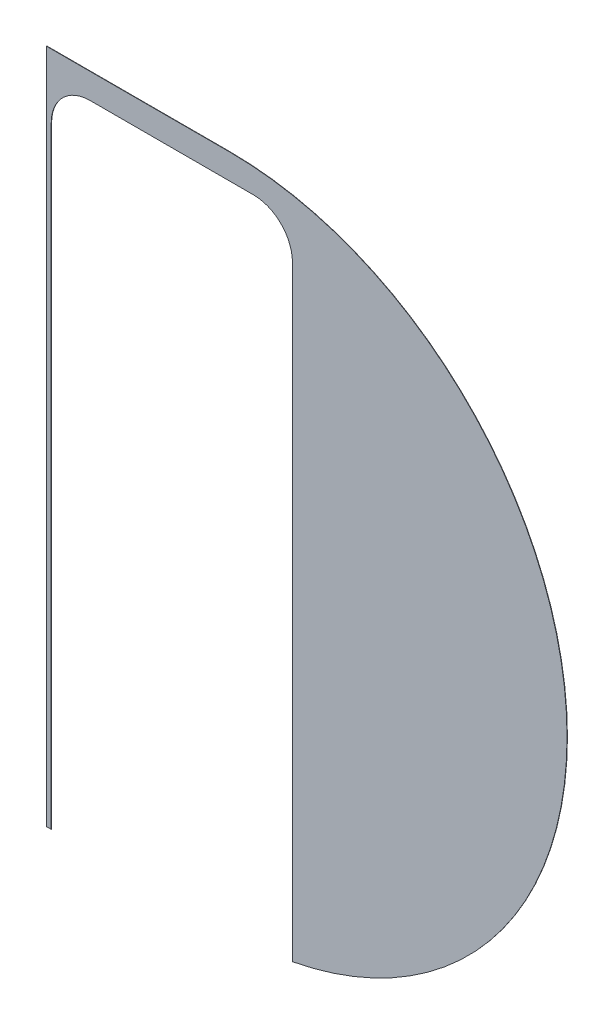
ISO-10303-21;
HEADER;
FILE_DESCRIPTION(('STEP AP214'),'2;1');
FILE_NAME('part.step','',(''),(''),'','','');
FILE_SCHEMA(('AUTOMOTIVE_DESIGN { 1 0 10303 214 1 1 1 1 }'));
ENDSEC;
DATA;
#1=APPLICATION_CONTEXT('core data for automotive mechanical design processes');
#2=APPLICATION_PROTOCOL_DEFINITION('international standard','automotive_design',2000,#1);
#3=PRODUCT_CONTEXT('',#1,'mechanical');
#4=PRODUCT('Part','Part','',(#3));
#5=PRODUCT_RELATED_PRODUCT_CATEGORY('part','',(#4));
#6=PRODUCT_DEFINITION_FORMATION('','',#4);
#7=PRODUCT_DEFINITION_CONTEXT('part definition',#1,'design');
#8=PRODUCT_DEFINITION('design','',#6,#7);
#9=PRODUCT_DEFINITION_SHAPE('','',#8);
#10=(LENGTH_UNIT() NAMED_UNIT(*) SI_UNIT(.MILLI.,.METRE.));
#11=(NAMED_UNIT(*) PLANE_ANGLE_UNIT() SI_UNIT($,.RADIAN.));
#12=(NAMED_UNIT(*) SI_UNIT($,.STERADIAN.) SOLID_ANGLE_UNIT());
#13=UNCERTAINTY_MEASURE_WITH_UNIT(LENGTH_MEASURE(1.E-05),#10,'distance_accuracy_value','');
#14=(GEOMETRIC_REPRESENTATION_CONTEXT(3) GLOBAL_UNCERTAINTY_ASSIGNED_CONTEXT((#13)) GLOBAL_UNIT_ASSIGNED_CONTEXT((#10,
#11,#12)) REPRESENTATION_CONTEXT('',''));
#15=CARTESIAN_POINT('',(0.,0.,0.));
#16=DIRECTION('',(0.,0.,1.));
#17=DIRECTION('',(1.,0.,0.));
#18=AXIS2_PLACEMENT_3D('',#15,#16,#17);
#19=CARTESIAN_POINT('',(0.,0.,1.));
#20=DIRECTION('',(1.,0.,0.));
#21=DIRECTION('',(0.,1.,0.));
#22=AXIS2_PLACEMENT_3D('',#19,#20,#21);
#23=PLANE('',#22);
#24=DIRECTION('',(0.,-1.,0.));
#25=VECTOR('',#24,1.);
#26=CARTESIAN_POINT('',(0.,0.,0.));
#27=LINE('',#26,#25);
#28=CARTESIAN_POINT('',(-3.33066907387547E-13,1740.,0.));
#29=VERTEX_POINT('',#28);
#30=CARTESIAN_POINT('',(0.,0.,0.));
#31=VERTEX_POINT('',#30);
#32=EDGE_CURVE('E142',#29,#31,#27,.T.);
#33=ORIENTED_EDGE('',*,*,#32,.T.);
#34=DIRECTION('',(0.,0.,-1.));
#35=VECTOR('',#34,1.);
#36=CARTESIAN_POINT('',(0.,0.,1.));
#37=LINE('',#36,#35);
#38=CARTESIAN_POINT('',(0.,0.,1.));
#39=VERTEX_POINT('',#38);
#40=EDGE_CURVE('E161',#39,#31,#37,.T.);
#41=ORIENTED_EDGE('',*,*,#40,.F.);
#42=DIRECTION('',(0.,-1.,0.));
#43=VECTOR('',#42,1.);
#44=CARTESIAN_POINT('',(0.,0.,1.));
#45=LINE('',#44,#43);
#46=CARTESIAN_POINT('',(-3.33066907387547E-13,1740.,1.));
#47=VERTEX_POINT('',#46);
#48=EDGE_CURVE('E143',#47,#39,#45,.T.);
#49=ORIENTED_EDGE('',*,*,#48,.F.);
#50=DIRECTION('',(0.,0.,-1.));
#51=VECTOR('',#50,1.);
#52=CARTESIAN_POINT('',(-3.33066907387547E-13,1740.,1.));
#53=LINE('',#52,#51);
#54=EDGE_CURVE('E149',#47,#29,#53,.T.);
#55=ORIENTED_EDGE('',*,*,#54,.T.);
#56=EDGE_LOOP('',(#33,#41,#49,#55));
#57=FACE_BOUND('',#56,.T.);
#58=ADVANCED_FACE('F32',(#57),#23,.F.);
#59=CARTESIAN_POINT('',(0.,0.,1.));
#60=DIRECTION('',(0.,1.,0.));
#61=DIRECTION('',(0.,0.,1.));
#62=AXIS2_PLACEMENT_3D('',#59,#60,#61);
#63=PLANE('',#62);
#64=DIRECTION('',(1.,0.,0.));
#65=VECTOR('',#64,1.);
#66=CARTESIAN_POINT('',(0.,0.,0.));
#67=LINE('',#66,#65);
#68=CARTESIAN_POINT('',(12.,0.,0.));
#69=VERTEX_POINT('',#68);
#70=EDGE_CURVE('E152',#31,#69,#67,.T.);
#71=ORIENTED_EDGE('',*,*,#70,.T.);
#72=DIRECTION('',(0.,0.,1.));
#73=VECTOR('',#72,1.);
#74=CARTESIAN_POINT('',(11.9999999999998,0.,1.));
#75=LINE('',#74,#73);
#76=CARTESIAN_POINT('',(11.9999999999998,0.,1.));
#77=VERTEX_POINT('',#76);
#78=EDGE_CURVE('E46',#69,#77,#75,.T.);
#79=ORIENTED_EDGE('',*,*,#78,.T.);
#80=DIRECTION('',(1.,0.,0.));
#81=VECTOR('',#80,1.);
#82=CARTESIAN_POINT('',(0.,0.,1.));
#83=LINE('',#82,#81);
#84=EDGE_CURVE('E78',#39,#77,#83,.T.);
#85=ORIENTED_EDGE('',*,*,#84,.F.);
#86=ORIENTED_EDGE('',*,*,#40,.T.);
#87=EDGE_LOOP('',(#71,#79,#85,#86));
#88=FACE_BOUND('',#87,.T.);
#89=ADVANCED_FACE('F192',(#88),#63,.F.);
#90=CARTESIAN_POINT('',(470.,870.,1.));
#91=DIRECTION('',(0.,0.,-1.));
#92=DIRECTION('',(-1.,0.,0.));
#93=AXIS2_PLACEMENT_3D('',#90,#91,#92);
#94=CYLINDRICAL_SURFACE('',#93,870.);
#95=CARTESIAN_POINT('',(470.,870.,1.));
#96=DIRECTION('',(0.,0.,1.));
#97=DIRECTION('',(-1.,0.,0.));
#98=AXIS2_PLACEMENT_3D('',#95,#96,#97);
#99=CIRCLE('',#98,870.);
#100=CARTESIAN_POINT('',(632.999999999998,15.4059443221004,1.));
#101=VERTEX_POINT('',#100);
#102=CARTESIAN_POINT('',(470.,1740.,1.));
#103=VERTEX_POINT('',#102);
#104=EDGE_CURVE('E146',#101,#103,#99,.T.);
#105=ORIENTED_EDGE('',*,*,#104,.F.);
#106=DIRECTION('',(0.,0.,-1.));
#107=VECTOR('',#106,1.);
#108=CARTESIAN_POINT('',(632.999999999998,15.4059443221004,1.));
#109=LINE('',#108,#107);
#110=CARTESIAN_POINT('',(632.999999999998,15.4059443221004,0.));
#111=VERTEX_POINT('',#110);
#112=EDGE_CURVE('E136',#101,#111,#109,.T.);
#113=ORIENTED_EDGE('',*,*,#112,.T.);
#114=CARTESIAN_POINT('',(470.,870.,0.));
#115=DIRECTION('',(0.,0.,1.));
#116=DIRECTION('',(-1.,0.,0.));
#117=AXIS2_PLACEMENT_3D('',#114,#115,#116);
#118=CIRCLE('',#117,870.);
#119=CARTESIAN_POINT('',(470.,1740.,0.));
#120=VERTEX_POINT('',#119);
#121=EDGE_CURVE('E155',#111,#120,#118,.T.);
#122=ORIENTED_EDGE('',*,*,#121,.T.);
#123=DIRECTION('',(0.,0.,-1.));
#124=VECTOR('',#123,1.);
#125=CARTESIAN_POINT('',(470.,1740.,1.));
#126=LINE('',#125,#124);
#127=EDGE_CURVE('E159',#103,#120,#126,.T.);
#128=ORIENTED_EDGE('',*,*,#127,.F.);
#129=EDGE_LOOP('',(#105,#113,#122,#128));
#130=FACE_BOUND('',#129,.T.);
#131=ADVANCED_FACE('F187',(#130),#94,.T.);
#132=CARTESIAN_POINT('',(-3.33066907387547E-13,1740.,1.));
#133=DIRECTION('',(0.,-1.,0.));
#134=DIRECTION('',(0.,0.,-1.));
#135=AXIS2_PLACEMENT_3D('',#132,#133,#134);
#136=PLANE('',#135);
#137=DIRECTION('',(-1.,0.,0.));
#138=VECTOR('',#137,1.);
#139=CARTESIAN_POINT('',(-3.33066907387547E-13,1740.,0.));
#140=LINE('',#139,#138);
#141=EDGE_CURVE('E72',#120,#29,#140,.T.);
#142=ORIENTED_EDGE('',*,*,#141,.T.);
#143=ORIENTED_EDGE('',*,*,#54,.F.);
#144=DIRECTION('',(-1.,0.,0.));
#145=VECTOR('',#144,1.);
#146=CARTESIAN_POINT('',(-3.33066907387547E-13,1740.,1.));
#147=LINE('',#146,#145);
#148=EDGE_CURVE('E55',#103,#47,#147,.T.);
#149=ORIENTED_EDGE('',*,*,#148,.F.);
#150=ORIENTED_EDGE('',*,*,#127,.T.);
#151=EDGE_LOOP('',(#142,#143,#149,#150));
#152=FACE_BOUND('',#151,.T.);
#153=ADVANCED_FACE('F188',(#152),#136,.F.);
#154=CARTESIAN_POINT('',(470.,870.,1.));
#155=DIRECTION('',(0.,0.,-1.));
#156=DIRECTION('',(-1.,0.,0.));
#157=AXIS2_PLACEMENT_3D('',#154,#155,#156);
#158=PLANE('',#157);
#159=CARTESIAN_POINT('',(532.999999999999,1575.,1.));
#160=DIRECTION('',(0.,0.,-1.));
#161=DIRECTION('',(-1.,0.,0.));
#162=AXIS2_PLACEMENT_3D('',#159,#160,#161);
#163=CIRCLE('',#162,100.);
#164=CARTESIAN_POINT('',(532.999999999999,1675.,1.));
#165=VERTEX_POINT('',#164);
#166=CARTESIAN_POINT('',(632.999999999999,1575.,1.));
#167=VERTEX_POINT('',#166);
#168=EDGE_CURVE('E134',#165,#167,#163,.T.);
#169=ORIENTED_EDGE('',*,*,#168,.T.);
#170=DIRECTION('',(0.,-1.,0.));
#171=VECTOR('',#170,1.);
#172=CARTESIAN_POINT('',(632.999999999999,870.,1.));
#173=LINE('',#172,#171);
#174=EDGE_CURVE('E139',#167,#101,#173,.T.);
#175=ORIENTED_EDGE('',*,*,#174,.T.);
#176=ORIENTED_EDGE('',*,*,#104,.T.);
#177=ORIENTED_EDGE('',*,*,#148,.T.);
#178=ORIENTED_EDGE('',*,*,#48,.T.);
#179=ORIENTED_EDGE('',*,*,#84,.T.);
#180=DIRECTION('',(0.,1.,0.));
#181=VECTOR('',#180,1.);
#182=CARTESIAN_POINT('',(12.0000000000001,870.,1.));
#183=LINE('',#182,#181);
#184=CARTESIAN_POINT('',(12.0000000000001,1575.,1.));
#185=VERTEX_POINT('',#184);
#186=EDGE_CURVE('E122',#77,#185,#183,.T.);
#187=ORIENTED_EDGE('',*,*,#186,.T.);
#188=CARTESIAN_POINT('',(112.,1575.,1.));
#189=DIRECTION('',(0.,0.,-1.));
#190=DIRECTION('',(-1.,0.,0.));
#191=AXIS2_PLACEMENT_3D('',#188,#189,#190);
#192=CIRCLE('',#191,100.);
#193=CARTESIAN_POINT('',(112.,1675.,1.));
#194=VERTEX_POINT('',#193);
#195=EDGE_CURVE('E112',#185,#194,#192,.T.);
#196=ORIENTED_EDGE('',*,*,#195,.T.);
#197=DIRECTION('',(1.,0.,0.));
#198=VECTOR('',#197,1.);
#199=CARTESIAN_POINT('',(470.,1675.,1.));
#200=LINE('',#199,#198);
#201=EDGE_CURVE('E121',#194,#165,#200,.T.);
#202=ORIENTED_EDGE('',*,*,#201,.T.);
#203=EDGE_LOOP('',(#169,#175,#176,#177,#178,#179,#187,#196,#202));
#204=FACE_BOUND('',#203,.T.);
#205=ADVANCED_FACE('F128',(#204),#158,.F.);
#206=CARTESIAN_POINT('',(470.,870.,0.));
#207=DIRECTION('',(0.,0.,-1.));
#208=DIRECTION('',(-1.,0.,0.));
#209=AXIS2_PLACEMENT_3D('',#206,#207,#208);
#210=PLANE('',#209);
#211=DIRECTION('',(0.,-1.,0.));
#212=VECTOR('',#211,1.);
#213=CARTESIAN_POINT('',(632.999999999999,870.,0.));
#214=LINE('',#213,#212);
#215=CARTESIAN_POINT('',(632.999999999999,1575.,0.));
#216=VERTEX_POINT('',#215);
#217=EDGE_CURVE('E11',#216,#111,#214,.T.);
#218=ORIENTED_EDGE('',*,*,#217,.F.);
#219=CARTESIAN_POINT('',(532.999999999999,1575.,0.));
#220=DIRECTION('',(0.,0.,-1.));
#221=DIRECTION('',(-1.,0.,0.));
#222=AXIS2_PLACEMENT_3D('',#219,#220,#221);
#223=CIRCLE('',#222,100.);
#224=CARTESIAN_POINT('',(532.999999999999,1675.,0.));
#225=VERTEX_POINT('',#224);
#226=EDGE_CURVE('E39',#225,#216,#223,.T.);
#227=ORIENTED_EDGE('',*,*,#226,.F.);
#228=DIRECTION('',(1.,0.,0.));
#229=VECTOR('',#228,1.);
#230=CARTESIAN_POINT('',(470.,1675.,0.));
#231=LINE('',#230,#229);
#232=CARTESIAN_POINT('',(112.,1675.,0.));
#233=VERTEX_POINT('',#232);
#234=EDGE_CURVE('E166',#233,#225,#231,.T.);
#235=ORIENTED_EDGE('',*,*,#234,.F.);
#236=CARTESIAN_POINT('',(112.,1575.,0.));
#237=DIRECTION('',(0.,0.,-1.));
#238=DIRECTION('',(-1.,0.,0.));
#239=AXIS2_PLACEMENT_3D('',#236,#237,#238);
#240=CIRCLE('',#239,100.);
#241=CARTESIAN_POINT('',(12.0000000000001,1575.,0.));
#242=VERTEX_POINT('',#241);
#243=EDGE_CURVE('E164',#242,#233,#240,.T.);
#244=ORIENTED_EDGE('',*,*,#243,.F.);
#245=DIRECTION('',(0.,1.,0.));
#246=VECTOR('',#245,1.);
#247=CARTESIAN_POINT('',(12.0000000000001,870.,0.));
#248=LINE('',#247,#246);
#249=EDGE_CURVE('E125',#69,#242,#248,.T.);
#250=ORIENTED_EDGE('',*,*,#249,.F.);
#251=ORIENTED_EDGE('',*,*,#70,.F.);
#252=ORIENTED_EDGE('',*,*,#32,.F.);
#253=ORIENTED_EDGE('',*,*,#141,.F.);
#254=ORIENTED_EDGE('',*,*,#121,.F.);
#255=EDGE_LOOP('',(#218,#227,#235,#244,#250,#251,#252,#253,#254));
#256=FACE_BOUND('',#255,.T.);
#257=ADVANCED_FACE('F182',(#256),#210,.T.);
#258=CARTESIAN_POINT('',(632.999999999998,-75.0000000000028,298.));
#259=DIRECTION('',(1.,0.,0.));
#260=DIRECTION('',(0.,1.,0.));
#261=AXIS2_PLACEMENT_3D('',#258,#259,#260);
#262=PLANE('',#261);
#263=DIRECTION('',(0.,0.,-1.));
#264=VECTOR('',#263,1.);
#265=CARTESIAN_POINT('',(632.999999999999,1575.,298.));
#266=LINE('',#265,#264);
#267=EDGE_CURVE('E130',#167,#216,#266,.T.);
#268=ORIENTED_EDGE('',*,*,#267,.T.);
#269=ORIENTED_EDGE('',*,*,#217,.T.);
#270=ORIENTED_EDGE('',*,*,#112,.F.);
#271=ORIENTED_EDGE('',*,*,#174,.F.);
#272=EDGE_LOOP('',(#268,#269,#270,#271));
#273=FACE_BOUND('',#272,.T.);
#274=ADVANCED_FACE('F179',(#273),#262,.F.);
#275=CARTESIAN_POINT('',(532.999999999999,1575.,298.));
#276=DIRECTION('',(0.,0.,-1.));
#277=DIRECTION('',(-1.,0.,0.));
#278=AXIS2_PLACEMENT_3D('',#275,#276,#277);
#279=CYLINDRICAL_SURFACE('',#278,100.);
#280=DIRECTION('',(0.,0.,-1.));
#281=VECTOR('',#280,1.);
#282=CARTESIAN_POINT('',(532.999999999999,1675.,298.));
#283=LINE('',#282,#281);
#284=EDGE_CURVE('E174',#165,#225,#283,.T.);
#285=ORIENTED_EDGE('',*,*,#284,.T.);
#286=ORIENTED_EDGE('',*,*,#226,.T.);
#287=ORIENTED_EDGE('',*,*,#267,.F.);
#288=ORIENTED_EDGE('',*,*,#168,.F.);
#289=EDGE_LOOP('',(#285,#286,#287,#288));
#290=FACE_BOUND('',#289,.T.);
#291=ADVANCED_FACE('F172',(#290),#279,.F.);
#292=CARTESIAN_POINT('',(532.999999999999,1675.,298.));
#293=DIRECTION('',(0.,1.,0.));
#294=DIRECTION('',(0.,0.,1.));
#295=AXIS2_PLACEMENT_3D('',#292,#293,#294);
#296=PLANE('',#295);
#297=DIRECTION('',(0.,0.,-1.));
#298=VECTOR('',#297,1.);
#299=CARTESIAN_POINT('',(112.,1675.,298.));
#300=LINE('',#299,#298);
#301=EDGE_CURVE('E118',#194,#233,#300,.T.);
#302=ORIENTED_EDGE('',*,*,#301,.T.);
#303=ORIENTED_EDGE('',*,*,#234,.T.);
#304=ORIENTED_EDGE('',*,*,#284,.F.);
#305=ORIENTED_EDGE('',*,*,#201,.F.);
#306=EDGE_LOOP('',(#302,#303,#304,#305));
#307=FACE_BOUND('',#306,.T.);
#308=ADVANCED_FACE('F194',(#307),#296,.F.);
#309=CARTESIAN_POINT('',(112.,1575.,298.));
#310=DIRECTION('',(0.,0.,-1.));
#311=DIRECTION('',(-1.,0.,0.));
#312=AXIS2_PLACEMENT_3D('',#309,#310,#311);
#313=CYLINDRICAL_SURFACE('',#312,100.);
#314=DIRECTION('',(0.,0.,-1.));
#315=VECTOR('',#314,1.);
#316=CARTESIAN_POINT('',(12.0000000000001,1575.,298.));
#317=LINE('',#316,#315);
#318=EDGE_CURVE('E115',#185,#242,#317,.T.);
#319=ORIENTED_EDGE('',*,*,#318,.T.);
#320=ORIENTED_EDGE('',*,*,#243,.T.);
#321=ORIENTED_EDGE('',*,*,#301,.F.);
#322=ORIENTED_EDGE('',*,*,#195,.F.);
#323=EDGE_LOOP('',(#319,#320,#321,#322));
#324=FACE_BOUND('',#323,.T.);
#325=ADVANCED_FACE('F114',(#324),#313,.F.);
#326=CARTESIAN_POINT('',(11.9999999999998,-75.0000000000028,298.));
#327=DIRECTION('',(-1.,0.,0.));
#328=DIRECTION('',(0.,-1.,0.));
#329=AXIS2_PLACEMENT_3D('',#326,#327,#328);
#330=PLANE('',#329);
#331=ORIENTED_EDGE('',*,*,#78,.F.);
#332=ORIENTED_EDGE('',*,*,#249,.T.);
#333=ORIENTED_EDGE('',*,*,#318,.F.);
#334=ORIENTED_EDGE('',*,*,#186,.F.);
#335=EDGE_LOOP('',(#331,#332,#333,#334));
#336=FACE_BOUND('',#335,.T.);
#337=ADVANCED_FACE('F124',(#336),#330,.F.);
#338=CLOSED_SHELL('',(#58,#89,#131,#153,#205,#257,#274,#291,#308,#325,#337));
#339=MANIFOLD_SOLID_BREP('B2',#338);
#340=ADVANCED_BREP_SHAPE_REPRESENTATION('',(#18,#339),#14);
#341=SHAPE_DEFINITION_REPRESENTATION(#9,#340);
ENDSEC;
END-ISO-10303-21;
